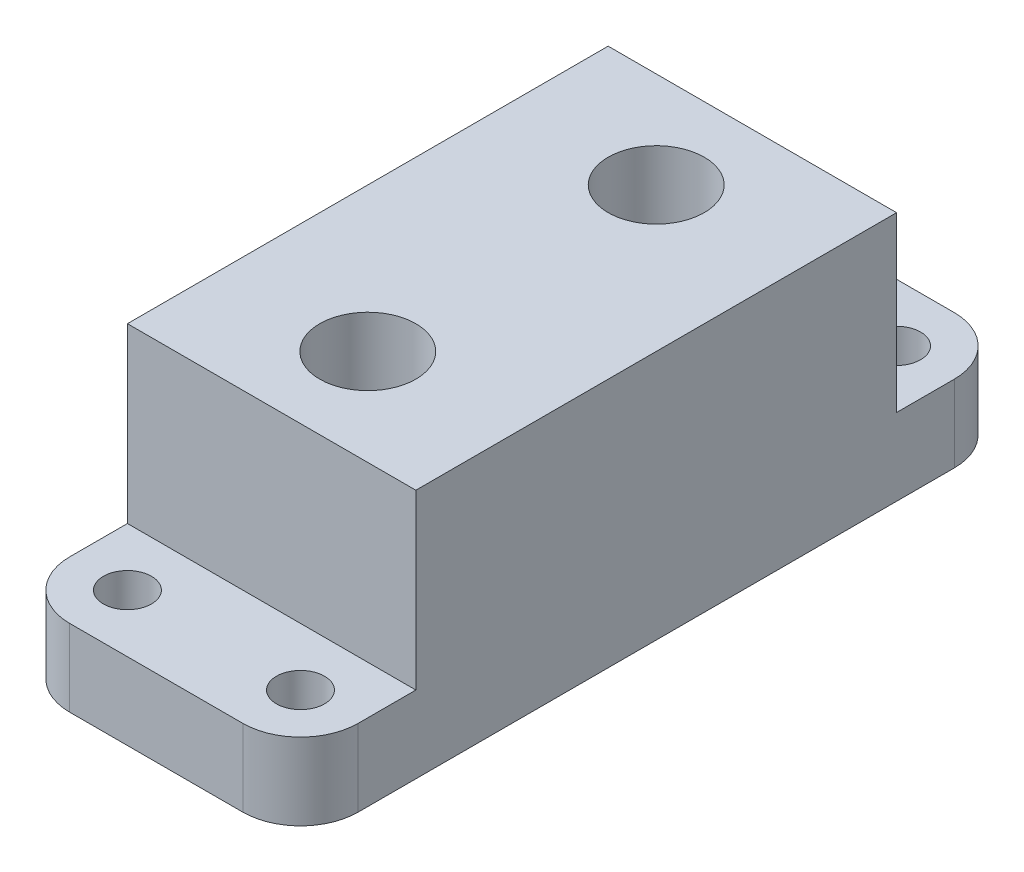
ISO-10303-21;
HEADER;
FILE_DESCRIPTION(('STEP AP214'),'2;1');
FILE_NAME('part.step','',(''),(''),'','','');
FILE_SCHEMA(('AUTOMOTIVE_DESIGN { 1 0 10303 214 1 1 1 1 }'));
ENDSEC;
DATA;
#1=APPLICATION_CONTEXT('core data for automotive mechanical design processes');
#2=APPLICATION_PROTOCOL_DEFINITION('international standard','automotive_design',2000,#1);
#3=PRODUCT_CONTEXT('',#1,'mechanical');
#4=PRODUCT('Part','Part','',(#3));
#5=PRODUCT_RELATED_PRODUCT_CATEGORY('part','',(#4));
#6=PRODUCT_DEFINITION_FORMATION('','',#4);
#7=PRODUCT_DEFINITION_CONTEXT('part definition',#1,'design');
#8=PRODUCT_DEFINITION('design','',#6,#7);
#9=PRODUCT_DEFINITION_SHAPE('','',#8);
#10=(LENGTH_UNIT() NAMED_UNIT(*) SI_UNIT(.MILLI.,.METRE.));
#11=(NAMED_UNIT(*) PLANE_ANGLE_UNIT() SI_UNIT($,.RADIAN.));
#12=(NAMED_UNIT(*) SI_UNIT($,.STERADIAN.) SOLID_ANGLE_UNIT());
#13=UNCERTAINTY_MEASURE_WITH_UNIT(LENGTH_MEASURE(1.E-05),#10,'distance_accuracy_value','');
#14=(GEOMETRIC_REPRESENTATION_CONTEXT(3) GLOBAL_UNCERTAINTY_ASSIGNED_CONTEXT((#13)) GLOBAL_UNIT_ASSIGNED_CONTEXT((#10,
#11,#12)) REPRESENTATION_CONTEXT('',''));
#15=CARTESIAN_POINT('',(0.,0.,0.));
#16=DIRECTION('',(0.,0.,1.));
#17=DIRECTION('',(1.,0.,0.));
#18=AXIS2_PLACEMENT_3D('',#15,#16,#17);
#19=CARTESIAN_POINT('',(-32.5,4.,12.5));
#20=DIRECTION('',(0.,0.,-1.));
#21=DIRECTION('',(-1.,0.,0.));
#22=AXIS2_PLACEMENT_3D('',#19,#20,#21);
#23=PLANE('',#22);
#24=DIRECTION('',(-1.,0.,0.));
#25=VECTOR('',#24,1.);
#26=CARTESIAN_POINT('',(-7.5,8.,12.5));
#27=LINE('',#26,#25);
#28=CARTESIAN_POINT('',(7.5,8.,12.5));
#29=VERTEX_POINT('',#28);
#30=CARTESIAN_POINT('',(-7.5,8.,12.5));
#31=VERTEX_POINT('',#30);
#32=EDGE_CURVE('E171',#29,#31,#27,.T.);
#33=ORIENTED_EDGE('',*,*,#32,.F.);
#34=DIRECTION('',(0.,-1.,0.));
#35=VECTOR('',#34,1.);
#36=CARTESIAN_POINT('',(7.5,17.,12.5));
#37=LINE('',#36,#35);
#38=CARTESIAN_POINT('',(7.5,17.,12.5));
#39=VERTEX_POINT('',#38);
#40=EDGE_CURVE('E210',#39,#29,#37,.T.);
#41=ORIENTED_EDGE('',*,*,#40,.F.);
#42=DIRECTION('',(1.,0.,0.));
#43=VECTOR('',#42,1.);
#44=CARTESIAN_POINT('',(-7.5,17.,12.5));
#45=LINE('',#44,#43);
#46=CARTESIAN_POINT('',(-7.5,17.,12.5));
#47=VERTEX_POINT('',#46);
#48=EDGE_CURVE('E243',#47,#39,#45,.T.);
#49=ORIENTED_EDGE('',*,*,#48,.F.);
#50=DIRECTION('',(0.,-1.,0.));
#51=VECTOR('',#50,1.);
#52=CARTESIAN_POINT('',(-7.5,17.,12.5));
#53=LINE('',#52,#51);
#54=EDGE_CURVE('E161',#47,#31,#53,.T.);
#55=ORIENTED_EDGE('',*,*,#54,.T.);
#56=EDGE_LOOP('',(#33,#41,#49,#55));
#57=FACE_BOUND('',#56,.T.);
#58=ADVANCED_FACE('F40',(#57),#23,.F.);
#59=CARTESIAN_POINT('',(-32.5,4.,-12.5));
#60=DIRECTION('',(0.,0.,1.));
#61=DIRECTION('',(1.,0.,0.));
#62=AXIS2_PLACEMENT_3D('',#59,#60,#61);
#63=PLANE('',#62);
#64=DIRECTION('',(0.,-1.,0.));
#65=VECTOR('',#64,1.);
#66=CARTESIAN_POINT('',(7.5,17.,-12.5));
#67=LINE('',#66,#65);
#68=CARTESIAN_POINT('',(7.5,17.,-12.5));
#69=VERTEX_POINT('',#68);
#70=CARTESIAN_POINT('',(7.5,8.,-12.5));
#71=VERTEX_POINT('',#70);
#72=EDGE_CURVE('E135',#69,#71,#67,.T.);
#73=ORIENTED_EDGE('',*,*,#72,.T.);
#74=DIRECTION('',(-1.,0.,0.));
#75=VECTOR('',#74,1.);
#76=CARTESIAN_POINT('',(-7.5,8.,-12.5));
#77=LINE('',#76,#75);
#78=CARTESIAN_POINT('',(-7.5,8.,-12.5));
#79=VERTEX_POINT('',#78);
#80=EDGE_CURVE('E143',#71,#79,#77,.T.);
#81=ORIENTED_EDGE('',*,*,#80,.T.);
#82=DIRECTION('',(0.,-1.,0.));
#83=VECTOR('',#82,1.);
#84=CARTESIAN_POINT('',(-7.5,17.,-12.5));
#85=LINE('',#84,#83);
#86=CARTESIAN_POINT('',(-7.5,17.,-12.5));
#87=VERTEX_POINT('',#86);
#88=EDGE_CURVE('E157',#87,#79,#85,.T.);
#89=ORIENTED_EDGE('',*,*,#88,.F.);
#90=DIRECTION('',(-1.,0.,0.));
#91=VECTOR('',#90,1.);
#92=CARTESIAN_POINT('',(-7.5,17.,-12.5));
#93=LINE('',#92,#91);
#94=EDGE_CURVE('E154',#69,#87,#93,.T.);
#95=ORIENTED_EDGE('',*,*,#94,.F.);
#96=EDGE_LOOP('',(#73,#81,#89,#95));
#97=FACE_BOUND('',#96,.T.);
#98=ADVANCED_FACE('F153',(#97),#63,.F.);
#99=CARTESIAN_POINT('',(7.5,17.,-12.5));
#100=DIRECTION('',(-1.,0.,0.));
#101=DIRECTION('',(0.,0.,1.));
#102=AXIS2_PLACEMENT_3D('',#99,#100,#101);
#103=PLANE('',#102);
#104=DIRECTION('',(0.,0.,-1.));
#105=VECTOR('',#104,1.);
#106=CARTESIAN_POINT('',(7.5,4.,-12.5));
#107=LINE('',#106,#105);
#108=CARTESIAN_POINT('',(7.5,4.,15.5));
#109=VERTEX_POINT('',#108);
#110=CARTESIAN_POINT('',(7.5,4.,-15.5));
#111=VERTEX_POINT('',#110);
#112=EDGE_CURVE('E220',#109,#111,#107,.T.);
#113=ORIENTED_EDGE('',*,*,#112,.T.);
#114=DIRECTION('',(0.,1.,0.));
#115=VECTOR('',#114,1.);
#116=CARTESIAN_POINT('',(7.5,17.,-15.5));
#117=LINE('',#116,#115);
#118=CARTESIAN_POINT('',(7.5,8.,-15.5));
#119=VERTEX_POINT('',#118);
#120=EDGE_CURVE('E137',#111,#119,#117,.T.);
#121=ORIENTED_EDGE('',*,*,#120,.T.);
#122=DIRECTION('',(0.,0.,1.));
#123=VECTOR('',#122,1.);
#124=CARTESIAN_POINT('',(7.5,8.,-18.5));
#125=LINE('',#124,#123);
#126=EDGE_CURVE('E130',#119,#71,#125,.T.);
#127=ORIENTED_EDGE('',*,*,#126,.T.);
#128=ORIENTED_EDGE('',*,*,#72,.F.);
#129=DIRECTION('',(0.,0.,-1.));
#130=VECTOR('',#129,1.);
#131=CARTESIAN_POINT('',(7.5,17.,-12.5));
#132=LINE('',#131,#130);
#133=EDGE_CURVE('E237',#39,#69,#132,.T.);
#134=ORIENTED_EDGE('',*,*,#133,.F.);
#135=ORIENTED_EDGE('',*,*,#40,.T.);
#136=DIRECTION('',(0.,0.,-1.));
#137=VECTOR('',#136,1.);
#138=CARTESIAN_POINT('',(7.5,8.,18.5));
#139=LINE('',#138,#137);
#140=CARTESIAN_POINT('',(7.5,8.,15.5));
#141=VERTEX_POINT('',#140);
#142=EDGE_CURVE('E204',#141,#29,#139,.T.);
#143=ORIENTED_EDGE('',*,*,#142,.F.);
#144=DIRECTION('',(0.,1.,0.));
#145=VECTOR('',#144,1.);
#146=CARTESIAN_POINT('',(7.5,17.,15.5));
#147=LINE('',#146,#145);
#148=EDGE_CURVE('E188',#141,#109,#147,.F.);
#149=ORIENTED_EDGE('',*,*,#148,.T.);
#150=EDGE_LOOP('',(#113,#121,#127,#128,#134,#135,#143,#149));
#151=FACE_BOUND('',#150,.T.);
#152=ADVANCED_FACE('F132',(#151),#103,.F.);
#153=CARTESIAN_POINT('',(-7.5,17.,-12.5));
#154=DIRECTION('',(1.,0.,0.));
#155=DIRECTION('',(0.,0.,-1.));
#156=AXIS2_PLACEMENT_3D('',#153,#154,#155);
#157=PLANE('',#156);
#158=DIRECTION('',(0.,0.,1.));
#159=VECTOR('',#158,1.);
#160=CARTESIAN_POINT('',(-7.5,8.,-18.5));
#161=LINE('',#160,#159);
#162=CARTESIAN_POINT('',(-7.5,8.,-15.5));
#163=VERTEX_POINT('',#162);
#164=EDGE_CURVE('E139',#163,#79,#161,.T.);
#165=ORIENTED_EDGE('',*,*,#164,.F.);
#166=DIRECTION('',(0.,-1.,0.));
#167=VECTOR('',#166,1.);
#168=CARTESIAN_POINT('',(-7.5,17.,-15.5));
#169=LINE('',#168,#167);
#170=CARTESIAN_POINT('',(-7.5,4.,-15.5));
#171=VERTEX_POINT('',#170);
#172=EDGE_CURVE('E159',#163,#171,#169,.T.);
#173=ORIENTED_EDGE('',*,*,#172,.T.);
#174=DIRECTION('',(0.,0.,1.));
#175=VECTOR('',#174,1.);
#176=CARTESIAN_POINT('',(-7.5,4.,-12.5));
#177=LINE('',#176,#175);
#178=CARTESIAN_POINT('',(-7.5,4.,15.5));
#179=VERTEX_POINT('',#178);
#180=EDGE_CURVE('E239',#171,#179,#177,.T.);
#181=ORIENTED_EDGE('',*,*,#180,.T.);
#182=DIRECTION('',(0.,-1.,0.));
#183=VECTOR('',#182,1.);
#184=CARTESIAN_POINT('',(-7.5,17.,15.5));
#185=LINE('',#184,#183);
#186=CARTESIAN_POINT('',(-7.5,8.,15.5));
#187=VERTEX_POINT('',#186);
#188=EDGE_CURVE('E156',#179,#187,#185,.F.);
#189=ORIENTED_EDGE('',*,*,#188,.T.);
#190=DIRECTION('',(0.,0.,-1.));
#191=VECTOR('',#190,1.);
#192=CARTESIAN_POINT('',(-7.5,8.,18.5));
#193=LINE('',#192,#191);
#194=EDGE_CURVE('E212',#187,#31,#193,.T.);
#195=ORIENTED_EDGE('',*,*,#194,.T.);
#196=ORIENTED_EDGE('',*,*,#54,.F.);
#197=DIRECTION('',(0.,0.,1.));
#198=VECTOR('',#197,1.);
#199=CARTESIAN_POINT('',(-7.5,17.,-12.5));
#200=LINE('',#199,#198);
#201=EDGE_CURVE('E241',#87,#47,#200,.T.);
#202=ORIENTED_EDGE('',*,*,#201,.F.);
#203=ORIENTED_EDGE('',*,*,#88,.T.);
#204=EDGE_LOOP('',(#165,#173,#181,#189,#195,#196,#202,#203));
#205=FACE_BOUND('',#204,.T.);
#206=ADVANCED_FACE('F264',(#205),#157,.F.);
#207=CARTESIAN_POINT('',(0.,17.,0.));
#208=DIRECTION('',(0.,1.,0.));
#209=DIRECTION('',(0.,0.,1.));
#210=AXIS2_PLACEMENT_3D('',#207,#208,#209);
#211=PLANE('',#210);
#212=CARTESIAN_POINT('',(0.,17.,-7.49999999999999));
#213=DIRECTION('',(0.,-1.,0.));
#214=DIRECTION('',(0.,0.,-1.));
#215=AXIS2_PLACEMENT_3D('',#212,#213,#214);
#216=CIRCLE('',#215,2.5);
#217=CARTESIAN_POINT('',(0.,17.,-9.99999999999999));
#218=VERTEX_POINT('',#217);
#219=EDGE_CURVE('E232',#218,#218,#216,.T.);
#220=ORIENTED_EDGE('',*,*,#219,.T.);
#221=EDGE_LOOP('',(#220));
#222=FACE_BOUND('',#221,.T.);
#223=CARTESIAN_POINT('',(0.,17.,7.49999999999999));
#224=DIRECTION('',(0.,-1.,0.));
#225=DIRECTION('',(0.,0.,1.));
#226=AXIS2_PLACEMENT_3D('',#223,#224,#225);
#227=CIRCLE('',#226,2.5);
#228=CARTESIAN_POINT('',(0.,17.,9.99999999999999));
#229=VERTEX_POINT('',#228);
#230=EDGE_CURVE('E211',#229,#229,#227,.T.);
#231=ORIENTED_EDGE('',*,*,#230,.T.);
#232=EDGE_LOOP('',(#231));
#233=FACE_BOUND('',#232,.T.);
#234=ORIENTED_EDGE('',*,*,#133,.T.);
#235=ORIENTED_EDGE('',*,*,#94,.T.);
#236=ORIENTED_EDGE('',*,*,#201,.T.);
#237=ORIENTED_EDGE('',*,*,#48,.T.);
#238=EDGE_LOOP('',(#234,#235,#236,#237));
#239=FACE_BOUND('',#238,.T.);
#240=ADVANCED_FACE('F336',(#222,#233,#239),#211,.T.);
#241=CARTESIAN_POINT('',(0.,17.,7.49999999999999));
#242=DIRECTION('',(0.,-1.,0.));
#243=DIRECTION('',(0.,0.,-1.));
#244=AXIS2_PLACEMENT_3D('',#241,#242,#243);
#245=CYLINDRICAL_SURFACE('',#244,2.5);
#246=CARTESIAN_POINT('',(0.,4.,7.49999999999999));
#247=DIRECTION('',(0.,1.,0.));
#248=DIRECTION('',(0.,0.,1.));
#249=AXIS2_PLACEMENT_3D('',#246,#247,#248);
#250=CIRCLE('',#249,2.5);
#251=CARTESIAN_POINT('',(0.,4.,9.99999999999999));
#252=VERTEX_POINT('',#251);
#253=EDGE_CURVE('E509',#252,#252,#250,.F.);
#254=ORIENTED_EDGE('',*,*,#253,.T.);
#255=EDGE_LOOP('',(#254));
#256=FACE_BOUND('',#255,.T.);
#257=ORIENTED_EDGE('',*,*,#230,.F.);
#258=EDGE_LOOP('',(#257));
#259=FACE_BOUND('',#258,.T.);
#260=ADVANCED_FACE('F343',(#256,#259),#245,.F.);
#261=CARTESIAN_POINT('',(0.,17.,-7.49999999999999));
#262=DIRECTION('',(0.,-1.,0.));
#263=DIRECTION('',(0.,0.,-1.));
#264=AXIS2_PLACEMENT_3D('',#261,#262,#263);
#265=CYLINDRICAL_SURFACE('',#264,2.5);
#266=CARTESIAN_POINT('',(0.,4.,-7.49999999999999));
#267=DIRECTION('',(0.,1.,0.));
#268=DIRECTION('',(0.,0.,1.));
#269=AXIS2_PLACEMENT_3D('',#266,#267,#268);
#270=CIRCLE('',#269,2.5);
#271=CARTESIAN_POINT('',(0.,4.,-4.99999999999999));
#272=VERTEX_POINT('',#271);
#273=EDGE_CURVE('E513',#272,#272,#270,.F.);
#274=ORIENTED_EDGE('',*,*,#273,.T.);
#275=EDGE_LOOP('',(#274));
#276=FACE_BOUND('',#275,.T.);
#277=ORIENTED_EDGE('',*,*,#219,.F.);
#278=EDGE_LOOP('',(#277));
#279=FACE_BOUND('',#278,.T.);
#280=ADVANCED_FACE('F275',(#276,#279),#265,.F.);
#281=CARTESIAN_POINT('',(-7.5,4.,18.5));
#282=DIRECTION('',(0.,1.,0.));
#283=DIRECTION('',(0.,0.,1.));
#284=AXIS2_PLACEMENT_3D('',#281,#282,#283);
#285=PLANE('',#284);
#286=CARTESIAN_POINT('',(-4.5,4.,15.5));
#287=DIRECTION('',(0.,-1.,0.));
#288=DIRECTION('',(0.,0.,-1.));
#289=AXIS2_PLACEMENT_3D('',#286,#287,#288);
#290=CIRCLE('',#289,1.25);
#291=CARTESIAN_POINT('',(-4.5,4.,14.25));
#292=VERTEX_POINT('',#291);
#293=EDGE_CURVE('E169',#292,#292,#290,.T.);
#294=ORIENTED_EDGE('',*,*,#293,.F.);
#295=EDGE_LOOP('',(#294));
#296=FACE_BOUND('',#295,.T.);
#297=CARTESIAN_POINT('',(4.5,4.,15.5));
#298=DIRECTION('',(0.,-1.,0.));
#299=DIRECTION('',(0.,0.,1.));
#300=AXIS2_PLACEMENT_3D('',#297,#298,#299);
#301=CIRCLE('',#300,1.25);
#302=CARTESIAN_POINT('',(4.5,4.,16.75));
#303=VERTEX_POINT('',#302);
#304=EDGE_CURVE('E228',#303,#303,#301,.T.);
#305=ORIENTED_EDGE('',*,*,#304,.F.);
#306=EDGE_LOOP('',(#305));
#307=FACE_BOUND('',#306,.T.);
#308=DIRECTION('',(1.,0.,0.));
#309=VECTOR('',#308,1.);
#310=CARTESIAN_POINT('',(-7.5,4.,18.5));
#311=LINE('',#310,#309);
#312=CARTESIAN_POINT('',(-4.5,4.,18.5));
#313=VERTEX_POINT('',#312);
#314=CARTESIAN_POINT('',(4.5,4.,18.5));
#315=VERTEX_POINT('',#314);
#316=EDGE_CURVE('E219',#313,#315,#311,.T.);
#317=ORIENTED_EDGE('',*,*,#316,.F.);
#318=CARTESIAN_POINT('',(-4.5,4.,15.5));
#319=DIRECTION('',(0.,1.,0.));
#320=DIRECTION('',(0.,0.,1.));
#321=AXIS2_PLACEMENT_3D('',#318,#319,#320);
#322=CIRCLE('',#321,3.);
#323=EDGE_CURVE('E199',#313,#179,#322,.F.);
#324=ORIENTED_EDGE('',*,*,#323,.T.);
#325=ORIENTED_EDGE('',*,*,#180,.F.);
#326=CARTESIAN_POINT('',(-4.5,4.,-15.5));
#327=DIRECTION('',(0.,-1.,0.));
#328=DIRECTION('',(0.,0.,-1.));
#329=AXIS2_PLACEMENT_3D('',#326,#327,#328);
#330=CIRCLE('',#329,3.);
#331=CARTESIAN_POINT('',(-4.5,4.,-18.5));
#332=VERTEX_POINT('',#331);
#333=EDGE_CURVE('E178',#171,#332,#330,.T.);
#334=ORIENTED_EDGE('',*,*,#333,.T.);
#335=DIRECTION('',(1.,0.,0.));
#336=VECTOR('',#335,1.);
#337=CARTESIAN_POINT('',(-7.5,4.,-18.5));
#338=LINE('',#337,#336);
#339=CARTESIAN_POINT('',(4.5,4.,-18.5));
#340=VERTEX_POINT('',#339);
#341=EDGE_CURVE('E140',#332,#340,#338,.T.);
#342=ORIENTED_EDGE('',*,*,#341,.T.);
#343=CARTESIAN_POINT('',(4.5,4.,-15.5));
#344=DIRECTION('',(0.,-1.,0.));
#345=DIRECTION('',(0.,0.,-1.));
#346=AXIS2_PLACEMENT_3D('',#343,#344,#345);
#347=CIRCLE('',#346,3.);
#348=EDGE_CURVE('E175',#340,#111,#347,.T.);
#349=ORIENTED_EDGE('',*,*,#348,.T.);
#350=ORIENTED_EDGE('',*,*,#112,.F.);
#351=CARTESIAN_POINT('',(4.5,4.,15.5));
#352=DIRECTION('',(0.,1.,0.));
#353=DIRECTION('',(0.,0.,1.));
#354=AXIS2_PLACEMENT_3D('',#351,#352,#353);
#355=CIRCLE('',#354,3.);
#356=EDGE_CURVE('E197',#109,#315,#355,.F.);
#357=ORIENTED_EDGE('',*,*,#356,.T.);
#358=EDGE_LOOP('',(#317,#324,#325,#334,#342,#349,#350,#357));
#359=FACE_BOUND('',#358,.T.);
#360=CARTESIAN_POINT('',(-4.5,4.,-15.5));
#361=DIRECTION('',(0.,1.,0.));
#362=DIRECTION('',(0.,0.,1.));
#363=AXIS2_PLACEMENT_3D('',#360,#361,#362);
#364=CIRCLE('',#363,1.25);
#365=CARTESIAN_POINT('',(-4.5,4.,-14.25));
#366=VERTEX_POINT('',#365);
#367=EDGE_CURVE('E496',#366,#366,#364,.T.);
#368=ORIENTED_EDGE('',*,*,#367,.T.);
#369=EDGE_LOOP('',(#368));
#370=FACE_BOUND('',#369,.T.);
#371=CARTESIAN_POINT('',(4.5,4.,-15.5));
#372=DIRECTION('',(0.,1.,0.));
#373=DIRECTION('',(0.,0.,-1.));
#374=AXIS2_PLACEMENT_3D('',#371,#372,#373);
#375=CIRCLE('',#374,1.25);
#376=CARTESIAN_POINT('',(4.5,4.,-16.75));
#377=VERTEX_POINT('',#376);
#378=EDGE_CURVE('E500',#377,#377,#375,.T.);
#379=ORIENTED_EDGE('',*,*,#378,.T.);
#380=EDGE_LOOP('',(#379));
#381=FACE_BOUND('',#380,.T.);
#382=ORIENTED_EDGE('',*,*,#273,.F.);
#383=EDGE_LOOP('',(#382));
#384=FACE_BOUND('',#383,.T.);
#385=ORIENTED_EDGE('',*,*,#253,.F.);
#386=EDGE_LOOP('',(#385));
#387=FACE_BOUND('',#386,.T.);
#388=ADVANCED_FACE('F217',(#296,#307,#359,#370,#381,#384,#387),#285,.F.);
#389=CARTESIAN_POINT('',(-7.5,8.,18.5));
#390=DIRECTION('',(0.,-1.,0.));
#391=DIRECTION('',(0.,0.,-1.));
#392=AXIS2_PLACEMENT_3D('',#389,#390,#391);
#393=PLANE('',#392);
#394=CARTESIAN_POINT('',(-4.5,8.,15.5));
#395=DIRECTION('',(0.,-1.,0.));
#396=DIRECTION('',(0.,0.,-1.));
#397=AXIS2_PLACEMENT_3D('',#394,#395,#396);
#398=CIRCLE('',#397,1.25);
#399=CARTESIAN_POINT('',(-4.5,8.,14.25));
#400=VERTEX_POINT('',#399);
#401=EDGE_CURVE('E168',#400,#400,#398,.T.);
#402=ORIENTED_EDGE('',*,*,#401,.T.);
#403=EDGE_LOOP('',(#402));
#404=FACE_BOUND('',#403,.T.);
#405=CARTESIAN_POINT('',(4.5,8.,15.5));
#406=DIRECTION('',(0.,-1.,0.));
#407=DIRECTION('',(0.,0.,-1.));
#408=AXIS2_PLACEMENT_3D('',#405,#406,#407);
#409=CIRCLE('',#408,1.25);
#410=CARTESIAN_POINT('',(4.5,8.,14.25));
#411=VERTEX_POINT('',#410);
#412=EDGE_CURVE('E165',#411,#411,#409,.T.);
#413=ORIENTED_EDGE('',*,*,#412,.T.);
#414=EDGE_LOOP('',(#413));
#415=FACE_BOUND('',#414,.T.);
#416=ORIENTED_EDGE('',*,*,#194,.F.);
#417=CARTESIAN_POINT('',(-4.5,8.,15.5));
#418=DIRECTION('',(0.,-1.,0.));
#419=DIRECTION('',(0.,0.,-1.));
#420=AXIS2_PLACEMENT_3D('',#417,#418,#419);
#421=CIRCLE('',#420,3.);
#422=CARTESIAN_POINT('',(-4.5,8.,18.5));
#423=VERTEX_POINT('',#422);
#424=EDGE_CURVE('E11',#187,#423,#421,.F.);
#425=ORIENTED_EDGE('',*,*,#424,.T.);
#426=DIRECTION('',(-1.,0.,0.));
#427=VECTOR('',#426,1.);
#428=CARTESIAN_POINT('',(-7.5,8.,18.5));
#429=LINE('',#428,#427);
#430=CARTESIAN_POINT('',(4.5,8.,18.5));
#431=VERTEX_POINT('',#430);
#432=EDGE_CURVE('E206',#431,#423,#429,.T.);
#433=ORIENTED_EDGE('',*,*,#432,.F.);
#434=CARTESIAN_POINT('',(4.5,8.,15.5));
#435=DIRECTION('',(0.,-1.,0.));
#436=DIRECTION('',(0.,0.,-1.));
#437=AXIS2_PLACEMENT_3D('',#434,#435,#436);
#438=CIRCLE('',#437,3.);
#439=EDGE_CURVE('E48',#431,#141,#438,.F.);
#440=ORIENTED_EDGE('',*,*,#439,.T.);
#441=ORIENTED_EDGE('',*,*,#142,.T.);
#442=ORIENTED_EDGE('',*,*,#32,.T.);
#443=EDGE_LOOP('',(#416,#425,#433,#440,#441,#442));
#444=FACE_BOUND('',#443,.T.);
#445=ADVANCED_FACE('F202',(#404,#415,#444),#393,.F.);
#446=CARTESIAN_POINT('',(0.,0.,18.5));
#447=DIRECTION('',(0.,0.,-1.));
#448=DIRECTION('',(-1.,0.,0.));
#449=AXIS2_PLACEMENT_3D('',#446,#447,#448);
#450=PLANE('',#449);
#451=ORIENTED_EDGE('',*,*,#432,.T.);
#452=DIRECTION('',(0.,-1.,0.));
#453=VECTOR('',#452,1.);
#454=CARTESIAN_POINT('',(-4.5,0.,18.5));
#455=LINE('',#454,#453);
#456=EDGE_CURVE('E194',#423,#313,#455,.T.);
#457=ORIENTED_EDGE('',*,*,#456,.T.);
#458=ORIENTED_EDGE('',*,*,#316,.T.);
#459=DIRECTION('',(0.,1.,0.));
#460=VECTOR('',#459,1.);
#461=CARTESIAN_POINT('',(4.5,0.,18.5));
#462=LINE('',#461,#460);
#463=EDGE_CURVE('E192',#315,#431,#462,.T.);
#464=ORIENTED_EDGE('',*,*,#463,.T.);
#465=EDGE_LOOP('',(#451,#457,#458,#464));
#466=FACE_BOUND('',#465,.T.);
#467=ADVANCED_FACE('F222',(#466),#450,.F.);
#468=CARTESIAN_POINT('',(4.5,17.,15.5));
#469=DIRECTION('',(0.,-1.,0.));
#470=DIRECTION('',(0.,0.,-1.));
#471=AXIS2_PLACEMENT_3D('',#468,#469,#470);
#472=CYLINDRICAL_SURFACE('',#471,1.25);
#473=ORIENTED_EDGE('',*,*,#304,.T.);
#474=EDGE_LOOP('',(#473));
#475=FACE_BOUND('',#474,.T.);
#476=ORIENTED_EDGE('',*,*,#412,.F.);
#477=EDGE_LOOP('',(#476));
#478=FACE_BOUND('',#477,.T.);
#479=ADVANCED_FACE('F279',(#475,#478),#472,.F.);
#480=CARTESIAN_POINT('',(-4.5,17.,15.5));
#481=DIRECTION('',(0.,-1.,0.));
#482=DIRECTION('',(0.,0.,-1.));
#483=AXIS2_PLACEMENT_3D('',#480,#481,#482);
#484=CYLINDRICAL_SURFACE('',#483,1.25);
#485=ORIENTED_EDGE('',*,*,#293,.T.);
#486=EDGE_LOOP('',(#485));
#487=FACE_BOUND('',#486,.T.);
#488=ORIENTED_EDGE('',*,*,#401,.F.);
#489=EDGE_LOOP('',(#488));
#490=FACE_BOUND('',#489,.T.);
#491=ADVANCED_FACE('F270',(#487,#490),#484,.F.);
#492=CARTESIAN_POINT('',(-7.5,8.,-18.5));
#493=DIRECTION('',(0.,1.,0.));
#494=DIRECTION('',(0.,0.,1.));
#495=AXIS2_PLACEMENT_3D('',#492,#493,#494);
#496=PLANE('',#495);
#497=CARTESIAN_POINT('',(-4.5,8.,-15.5));
#498=DIRECTION('',(0.,1.,0.));
#499=DIRECTION('',(0.,0.,1.));
#500=AXIS2_PLACEMENT_3D('',#497,#498,#499);
#501=CIRCLE('',#500,1.25);
#502=CARTESIAN_POINT('',(-4.5,8.,-14.25));
#503=VERTEX_POINT('',#502);
#504=EDGE_CURVE('E151',#503,#503,#501,.F.);
#505=ORIENTED_EDGE('',*,*,#504,.T.);
#506=EDGE_LOOP('',(#505));
#507=FACE_BOUND('',#506,.T.);
#508=CARTESIAN_POINT('',(4.5,8.,-15.5));
#509=DIRECTION('',(0.,1.,0.));
#510=DIRECTION('',(0.,0.,1.));
#511=AXIS2_PLACEMENT_3D('',#508,#509,#510);
#512=CIRCLE('',#511,1.25);
#513=CARTESIAN_POINT('',(4.5,8.,-14.25));
#514=VERTEX_POINT('',#513);
#515=EDGE_CURVE('E495',#514,#514,#512,.F.);
#516=ORIENTED_EDGE('',*,*,#515,.T.);
#517=EDGE_LOOP('',(#516));
#518=FACE_BOUND('',#517,.T.);
#519=DIRECTION('',(-1.,0.,0.));
#520=VECTOR('',#519,1.);
#521=CARTESIAN_POINT('',(-7.5,8.,-18.5));
#522=LINE('',#521,#520);
#523=CARTESIAN_POINT('',(4.5,8.,-18.5));
#524=VERTEX_POINT('',#523);
#525=CARTESIAN_POINT('',(-4.5,8.,-18.5));
#526=VERTEX_POINT('',#525);
#527=EDGE_CURVE('E150',#524,#526,#522,.T.);
#528=ORIENTED_EDGE('',*,*,#527,.T.);
#529=CARTESIAN_POINT('',(-4.5,8.,-15.5));
#530=DIRECTION('',(0.,1.,0.));
#531=DIRECTION('',(0.,0.,1.));
#532=AXIS2_PLACEMENT_3D('',#529,#530,#531);
#533=CIRCLE('',#532,3.);
#534=EDGE_CURVE('E186',#526,#163,#533,.T.);
#535=ORIENTED_EDGE('',*,*,#534,.T.);
#536=ORIENTED_EDGE('',*,*,#164,.T.);
#537=ORIENTED_EDGE('',*,*,#80,.F.);
#538=ORIENTED_EDGE('',*,*,#126,.F.);
#539=CARTESIAN_POINT('',(4.5,8.,-15.5));
#540=DIRECTION('',(0.,1.,0.));
#541=DIRECTION('',(0.,0.,1.));
#542=AXIS2_PLACEMENT_3D('',#539,#540,#541);
#543=CIRCLE('',#542,3.);
#544=EDGE_CURVE('E184',#119,#524,#543,.T.);
#545=ORIENTED_EDGE('',*,*,#544,.T.);
#546=EDGE_LOOP('',(#528,#535,#536,#537,#538,#545));
#547=FACE_BOUND('',#546,.T.);
#548=ADVANCED_FACE('F145',(#507,#518,#547),#496,.T.);
#549=CARTESIAN_POINT('',(0.,0.,-18.5));
#550=DIRECTION('',(0.,0.,1.));
#551=DIRECTION('',(-1.,0.,0.));
#552=AXIS2_PLACEMENT_3D('',#549,#550,#551);
#553=PLANE('',#552);
#554=ORIENTED_EDGE('',*,*,#341,.F.);
#555=DIRECTION('',(0.,-1.,0.));
#556=VECTOR('',#555,1.);
#557=CARTESIAN_POINT('',(-4.5,0.,-18.5));
#558=LINE('',#557,#556);
#559=EDGE_CURVE('E182',#332,#526,#558,.F.);
#560=ORIENTED_EDGE('',*,*,#559,.T.);
#561=ORIENTED_EDGE('',*,*,#527,.F.);
#562=DIRECTION('',(0.,1.,0.));
#563=VECTOR('',#562,1.);
#564=CARTESIAN_POINT('',(4.5,0.,-18.5));
#565=LINE('',#564,#563);
#566=EDGE_CURVE('E180',#524,#340,#565,.F.);
#567=ORIENTED_EDGE('',*,*,#566,.T.);
#568=EDGE_LOOP('',(#554,#560,#561,#567));
#569=FACE_BOUND('',#568,.T.);
#570=ADVANCED_FACE('F434',(#569),#553,.F.);
#571=CARTESIAN_POINT('',(4.5,17.,-15.5));
#572=DIRECTION('',(0.,-1.,0.));
#573=DIRECTION('',(0.,0.,-1.));
#574=AXIS2_PLACEMENT_3D('',#571,#572,#573);
#575=CYLINDRICAL_SURFACE('',#574,1.25);
#576=ORIENTED_EDGE('',*,*,#515,.F.);
#577=EDGE_LOOP('',(#576));
#578=FACE_BOUND('',#577,.T.);
#579=ORIENTED_EDGE('',*,*,#378,.F.);
#580=EDGE_LOOP('',(#579));
#581=FACE_BOUND('',#580,.T.);
#582=ADVANCED_FACE('F430',(#578,#581),#575,.F.);
#583=CARTESIAN_POINT('',(-4.5,17.,-15.5));
#584=DIRECTION('',(0.,-1.,0.));
#585=DIRECTION('',(0.,0.,-1.));
#586=AXIS2_PLACEMENT_3D('',#583,#584,#585);
#587=CYLINDRICAL_SURFACE('',#586,1.25);
#588=ORIENTED_EDGE('',*,*,#504,.F.);
#589=EDGE_LOOP('',(#588));
#590=FACE_BOUND('',#589,.T.);
#591=ORIENTED_EDGE('',*,*,#367,.F.);
#592=EDGE_LOOP('',(#591));
#593=FACE_BOUND('',#592,.T.);
#594=ADVANCED_FACE('F304',(#590,#593),#587,.F.);
#595=CARTESIAN_POINT('',(-4.5,17.,-15.5));
#596=DIRECTION('',(0.,-1.,0.));
#597=DIRECTION('',(0.,0.,-1.));
#598=AXIS2_PLACEMENT_3D('',#595,#596,#597);
#599=CYLINDRICAL_SURFACE('',#598,3.);
#600=ORIENTED_EDGE('',*,*,#534,.F.);
#601=ORIENTED_EDGE('',*,*,#559,.F.);
#602=ORIENTED_EDGE('',*,*,#333,.F.);
#603=ORIENTED_EDGE('',*,*,#172,.F.);
#604=EDGE_LOOP('',(#600,#601,#602,#603));
#605=FACE_BOUND('',#604,.T.);
#606=ADVANCED_FACE('F263',(#605),#599,.T.);
#607=CARTESIAN_POINT('',(4.5,17.,-15.5));
#608=DIRECTION('',(0.,1.,0.));
#609=DIRECTION('',(0.,0.,1.));
#610=AXIS2_PLACEMENT_3D('',#607,#608,#609);
#611=CYLINDRICAL_SURFACE('',#610,3.);
#612=ORIENTED_EDGE('',*,*,#348,.F.);
#613=ORIENTED_EDGE('',*,*,#566,.F.);
#614=ORIENTED_EDGE('',*,*,#544,.F.);
#615=ORIENTED_EDGE('',*,*,#120,.F.);
#616=EDGE_LOOP('',(#612,#613,#614,#615));
#617=FACE_BOUND('',#616,.T.);
#618=ADVANCED_FACE('F303',(#617),#611,.T.);
#619=CARTESIAN_POINT('',(-4.5,0.,15.5));
#620=DIRECTION('',(0.,-1.,0.));
#621=DIRECTION('',(0.,0.,-1.));
#622=AXIS2_PLACEMENT_3D('',#619,#620,#621);
#623=CYLINDRICAL_SURFACE('',#622,3.);
#624=ORIENTED_EDGE('',*,*,#424,.F.);
#625=ORIENTED_EDGE('',*,*,#188,.F.);
#626=ORIENTED_EDGE('',*,*,#323,.F.);
#627=ORIENTED_EDGE('',*,*,#456,.F.);
#628=EDGE_LOOP('',(#624,#625,#626,#627));
#629=FACE_BOUND('',#628,.T.);
#630=ADVANCED_FACE('F255',(#629),#623,.T.);
#631=CARTESIAN_POINT('',(4.5,0.,15.5));
#632=DIRECTION('',(0.,1.,0.));
#633=DIRECTION('',(0.,0.,1.));
#634=AXIS2_PLACEMENT_3D('',#631,#632,#633);
#635=CYLINDRICAL_SURFACE('',#634,3.);
#636=ORIENTED_EDGE('',*,*,#356,.F.);
#637=ORIENTED_EDGE('',*,*,#148,.F.);
#638=ORIENTED_EDGE('',*,*,#439,.F.);
#639=ORIENTED_EDGE('',*,*,#463,.F.);
#640=EDGE_LOOP('',(#636,#637,#638,#639));
#641=FACE_BOUND('',#640,.T.);
#642=ADVANCED_FACE('F42',(#641),#635,.T.);
#643=CLOSED_SHELL('',(#58,#98,#152,#206,#240,#260,#280,#388,#445,#467,#479,#491,#548,#570,#582,
#594,#606,#618,#630,#642));
#644=MANIFOLD_SOLID_BREP('B2',#643);
#645=ADVANCED_BREP_SHAPE_REPRESENTATION('',(#18,#644),#14);
#646=SHAPE_DEFINITION_REPRESENTATION(#9,#645);
ENDSEC;
END-ISO-10303-21;
